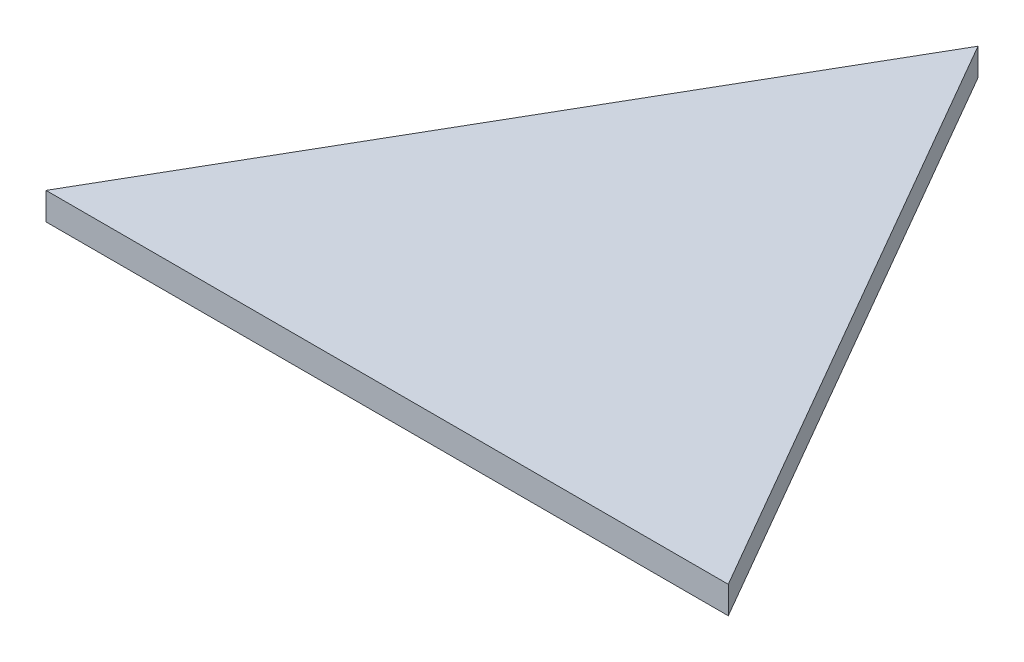
ISO-10303-21;
HEADER;
FILE_DESCRIPTION(('STEP AP214'),'2;1');
FILE_NAME('part.step','',(''),(''),'','','');
FILE_SCHEMA(('AUTOMOTIVE_DESIGN { 1 0 10303 214 1 1 1 1 }'));
ENDSEC;
DATA;
#1=APPLICATION_CONTEXT('core data for automotive mechanical design processes');
#2=APPLICATION_PROTOCOL_DEFINITION('international standard','automotive_design',2000,#1);
#3=PRODUCT_CONTEXT('',#1,'mechanical');
#4=PRODUCT('Part','Part','',(#3));
#5=PRODUCT_RELATED_PRODUCT_CATEGORY('part','',(#4));
#6=PRODUCT_DEFINITION_FORMATION('','',#4);
#7=PRODUCT_DEFINITION_CONTEXT('part definition',#1,'design');
#8=PRODUCT_DEFINITION('design','',#6,#7);
#9=PRODUCT_DEFINITION_SHAPE('','',#8);
#10=(LENGTH_UNIT() NAMED_UNIT(*) SI_UNIT(.MILLI.,.METRE.));
#11=(NAMED_UNIT(*) PLANE_ANGLE_UNIT() SI_UNIT($,.RADIAN.));
#12=(NAMED_UNIT(*) SI_UNIT($,.STERADIAN.) SOLID_ANGLE_UNIT());
#13=UNCERTAINTY_MEASURE_WITH_UNIT(LENGTH_MEASURE(1.E-05),#10,'distance_accuracy_value','');
#14=(GEOMETRIC_REPRESENTATION_CONTEXT(3) GLOBAL_UNCERTAINTY_ASSIGNED_CONTEXT((#13)) GLOBAL_UNIT_ASSIGNED_CONTEXT((#10,
#11,#12)) REPRESENTATION_CONTEXT('',''));
#15=CARTESIAN_POINT('',(0.,0.,0.));
#16=DIRECTION('',(0.,0.,1.));
#17=DIRECTION('',(1.,0.,0.));
#18=AXIS2_PLACEMENT_3D('',#15,#16,#17);
#19=CARTESIAN_POINT('',(25.,2.,-43.3012701892219));
#20=DIRECTION('',(0.866025403784439,0.,0.5));
#21=DIRECTION('',(0.5,0.,-0.866025403784439));
#22=AXIS2_PLACEMENT_3D('',#19,#20,#21);
#23=PLANE('',#22);
#24=DIRECTION('',(-0.5,0.,0.866025403784439));
#25=VECTOR('',#24,1.);
#26=CARTESIAN_POINT('',(25.,0.,-43.3012701892219));
#27=LINE('',#26,#25);
#28=CARTESIAN_POINT('',(25.,0.,-43.3012701892219));
#29=VERTEX_POINT('',#28);
#30=CARTESIAN_POINT('',(0.,0.,0.));
#31=VERTEX_POINT('',#30);
#32=EDGE_CURVE('E93',#29,#31,#27,.T.);
#33=ORIENTED_EDGE('',*,*,#32,.T.);
#34=DIRECTION('',(0.,-1.,0.));
#35=VECTOR('',#34,1.);
#36=CARTESIAN_POINT('',(0.,2.,0.));
#37=LINE('',#36,#35);
#38=CARTESIAN_POINT('',(0.,2.,0.));
#39=VERTEX_POINT('',#38);
#40=EDGE_CURVE('E11',#39,#31,#37,.T.);
#41=ORIENTED_EDGE('',*,*,#40,.F.);
#42=DIRECTION('',(-0.5,0.,0.866025403784439));
#43=VECTOR('',#42,1.);
#44=CARTESIAN_POINT('',(25.,2.,-43.3012701892219));
#45=LINE('',#44,#43);
#46=CARTESIAN_POINT('',(25.,2.,-43.3012701892219));
#47=VERTEX_POINT('',#46);
#48=EDGE_CURVE('E85',#47,#39,#45,.T.);
#49=ORIENTED_EDGE('',*,*,#48,.F.);
#50=DIRECTION('',(0.,-1.,0.));
#51=VECTOR('',#50,1.);
#52=CARTESIAN_POINT('',(25.,2.,-43.3012701892219));
#53=LINE('',#52,#51);
#54=EDGE_CURVE('E94',#47,#29,#53,.T.);
#55=ORIENTED_EDGE('',*,*,#54,.T.);
#56=EDGE_LOOP('',(#33,#41,#49,#55));
#57=FACE_BOUND('',#56,.T.);
#58=ADVANCED_FACE('F43',(#57),#23,.F.);
#59=CARTESIAN_POINT('',(0.,2.,0.));
#60=DIRECTION('',(0.,0.,-1.));
#61=DIRECTION('',(-1.,0.,0.));
#62=AXIS2_PLACEMENT_3D('',#59,#60,#61);
#63=PLANE('',#62);
#64=DIRECTION('',(1.,0.,0.));
#65=VECTOR('',#64,1.);
#66=CARTESIAN_POINT('',(0.,0.,0.));
#67=LINE('',#66,#65);
#68=CARTESIAN_POINT('',(50.,0.,0.));
#69=VERTEX_POINT('',#68);
#70=EDGE_CURVE('E72',#31,#69,#67,.T.);
#71=ORIENTED_EDGE('',*,*,#70,.T.);
#72=DIRECTION('',(0.,-1.,0.));
#73=VECTOR('',#72,1.);
#74=CARTESIAN_POINT('',(50.,2.,0.));
#75=LINE('',#74,#73);
#76=CARTESIAN_POINT('',(50.,2.,0.));
#77=VERTEX_POINT('',#76);
#78=EDGE_CURVE('E52',#77,#69,#75,.T.);
#79=ORIENTED_EDGE('',*,*,#78,.F.);
#80=DIRECTION('',(1.,0.,0.));
#81=VECTOR('',#80,1.);
#82=CARTESIAN_POINT('',(0.,2.,0.));
#83=LINE('',#82,#81);
#84=EDGE_CURVE('E80',#39,#77,#83,.T.);
#85=ORIENTED_EDGE('',*,*,#84,.F.);
#86=ORIENTED_EDGE('',*,*,#40,.T.);
#87=EDGE_LOOP('',(#71,#79,#85,#86));
#88=FACE_BOUND('',#87,.T.);
#89=ADVANCED_FACE('F81',(#88),#63,.F.);
#90=CARTESIAN_POINT('',(50.,2.,0.));
#91=DIRECTION('',(-0.866025403784439,0.,0.5));
#92=DIRECTION('',(0.5,0.,0.866025403784439));
#93=AXIS2_PLACEMENT_3D('',#90,#91,#92);
#94=PLANE('',#93);
#95=DIRECTION('',(-0.5,0.,-0.866025403784439));
#96=VECTOR('',#95,1.);
#97=CARTESIAN_POINT('',(50.,0.,0.));
#98=LINE('',#97,#96);
#99=EDGE_CURVE('E77',#69,#29,#98,.T.);
#100=ORIENTED_EDGE('',*,*,#99,.T.);
#101=ORIENTED_EDGE('',*,*,#54,.F.);
#102=DIRECTION('',(-0.5,0.,-0.866025403784439));
#103=VECTOR('',#102,1.);
#104=CARTESIAN_POINT('',(50.,2.,0.));
#105=LINE('',#104,#103);
#106=EDGE_CURVE('E60',#77,#47,#105,.T.);
#107=ORIENTED_EDGE('',*,*,#106,.F.);
#108=ORIENTED_EDGE('',*,*,#78,.T.);
#109=EDGE_LOOP('',(#100,#101,#107,#108));
#110=FACE_BOUND('',#109,.T.);
#111=ADVANCED_FACE('F106',(#110),#94,.F.);
#112=CARTESIAN_POINT('',(0.,2.,0.));
#113=DIRECTION('',(0.,1.,0.));
#114=DIRECTION('',(0.,0.,1.));
#115=AXIS2_PLACEMENT_3D('',#112,#113,#114);
#116=PLANE('',#115);
#117=ORIENTED_EDGE('',*,*,#48,.T.);
#118=ORIENTED_EDGE('',*,*,#84,.T.);
#119=ORIENTED_EDGE('',*,*,#106,.T.);
#120=EDGE_LOOP('',(#117,#118,#119));
#121=FACE_BOUND('',#120,.T.);
#122=ADVANCED_FACE('F88',(#121),#116,.T.);
#123=CARTESIAN_POINT('',(0.,0.,0.));
#124=DIRECTION('',(0.,1.,0.));
#125=DIRECTION('',(0.,0.,1.));
#126=AXIS2_PLACEMENT_3D('',#123,#124,#125);
#127=PLANE('',#126);
#128=ORIENTED_EDGE('',*,*,#32,.F.);
#129=ORIENTED_EDGE('',*,*,#99,.F.);
#130=ORIENTED_EDGE('',*,*,#70,.F.);
#131=EDGE_LOOP('',(#128,#129,#130));
#132=FACE_BOUND('',#131,.T.);
#133=ADVANCED_FACE('F107',(#132),#127,.F.);
#134=CLOSED_SHELL('',(#58,#89,#111,#122,#133));
#135=MANIFOLD_SOLID_BREP('B2',#134);
#136=ADVANCED_BREP_SHAPE_REPRESENTATION('',(#18,#135),#14);
#137=SHAPE_DEFINITION_REPRESENTATION(#9,#136);
ENDSEC;
END-ISO-10303-21;
